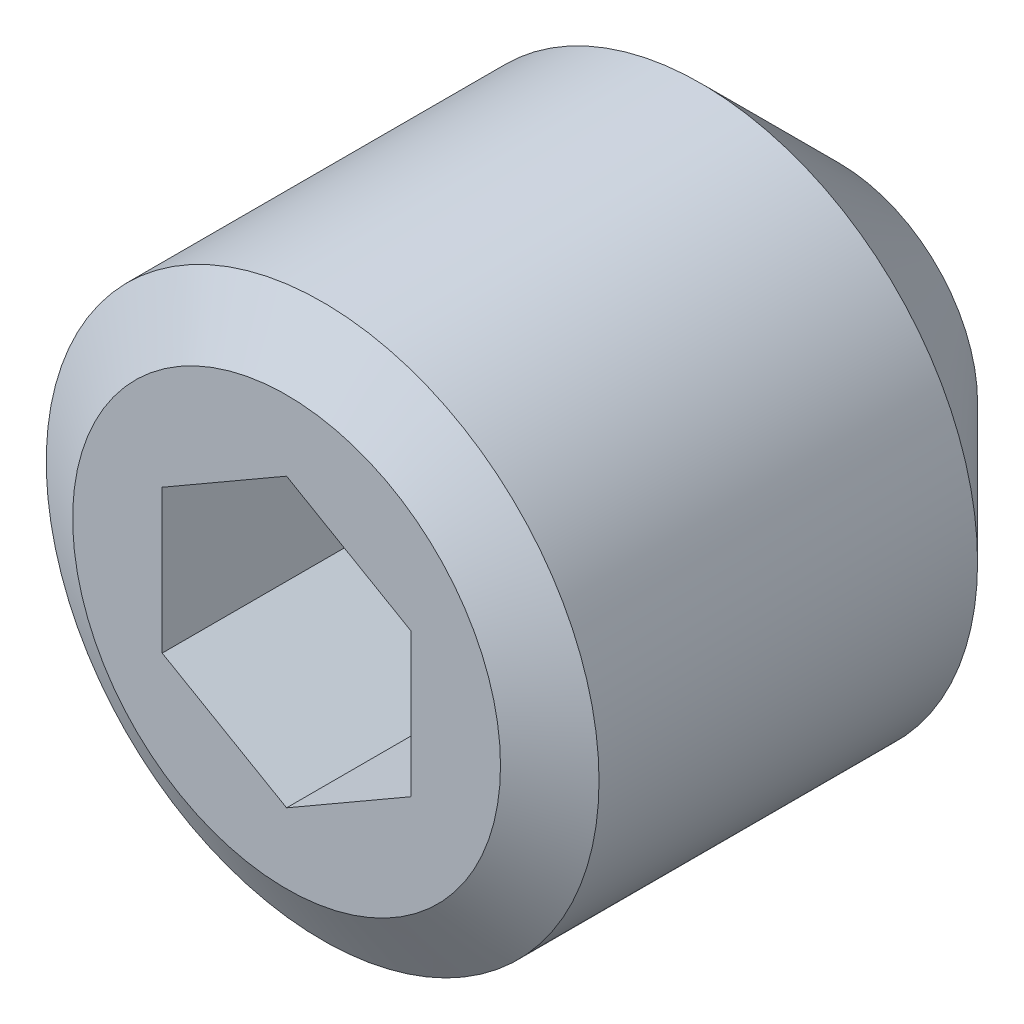
ISO-10303-21;
HEADER;
FILE_DESCRIPTION(('STEP AP214'),'2;1');
FILE_NAME('part.step','',(''),(''),'','','');
FILE_SCHEMA(('AUTOMOTIVE_DESIGN { 1 0 10303 214 1 1 1 1 }'));
ENDSEC;
DATA;
#1=APPLICATION_CONTEXT('core data for automotive mechanical design processes');
#2=APPLICATION_PROTOCOL_DEFINITION('international standard','automotive_design',2000,#1);
#3=PRODUCT_CONTEXT('',#1,'mechanical');
#4=PRODUCT('Part','Part','',(#3));
#5=PRODUCT_RELATED_PRODUCT_CATEGORY('part','',(#4));
#6=PRODUCT_DEFINITION_FORMATION('','',#4);
#7=PRODUCT_DEFINITION_CONTEXT('part definition',#1,'design');
#8=PRODUCT_DEFINITION('design','',#6,#7);
#9=PRODUCT_DEFINITION_SHAPE('','',#8);
#10=(LENGTH_UNIT() NAMED_UNIT(*) SI_UNIT(.MILLI.,.METRE.));
#11=(NAMED_UNIT(*) PLANE_ANGLE_UNIT() SI_UNIT($,.RADIAN.));
#12=(NAMED_UNIT(*) SI_UNIT($,.STERADIAN.) SOLID_ANGLE_UNIT());
#13=UNCERTAINTY_MEASURE_WITH_UNIT(LENGTH_MEASURE(1.E-05),#10,'distance_accuracy_value','');
#14=(GEOMETRIC_REPRESENTATION_CONTEXT(3) GLOBAL_UNCERTAINTY_ASSIGNED_CONTEXT((#13)) GLOBAL_UNIT_ASSIGNED_CONTEXT((#10,
#11,#12)) REPRESENTATION_CONTEXT('',''));
#15=CARTESIAN_POINT('',(0.,0.,0.));
#16=DIRECTION('',(0.,0.,1.));
#17=DIRECTION('',(1.,0.,0.));
#18=AXIS2_PLACEMENT_3D('',#15,#16,#17);
#19=CARTESIAN_POINT('',(0.,0.,0.));
#20=DIRECTION('',(0.,0.,-1.));
#21=DIRECTION('',(-1.,0.,0.));
#22=AXIS2_PLACEMENT_3D('',#19,#20,#21);
#23=PLANE('',#22);
#24=DIRECTION('',(0.866025403784439,0.5,0.));
#25=VECTOR('',#24,1.);
#26=CARTESIAN_POINT('',(0.,-0.519615242270663,0.));
#27=LINE('',#26,#25);
#28=CARTESIAN_POINT('',(0.,-0.519615242270663,0.));
#29=VERTEX_POINT('',#28);
#30=CARTESIAN_POINT('',(0.45,-0.259807621135332,0.));
#31=VERTEX_POINT('',#30);
#32=EDGE_CURVE('E105',#29,#31,#27,.T.);
#33=ORIENTED_EDGE('',*,*,#32,.F.);
#34=DIRECTION('',(0.866025403784439,-0.5,0.));
#35=VECTOR('',#34,1.);
#36=CARTESIAN_POINT('',(-0.45,-0.259807621135332,0.));
#37=LINE('',#36,#35);
#38=CARTESIAN_POINT('',(-0.45,-0.259807621135332,0.));
#39=VERTEX_POINT('',#38);
#40=EDGE_CURVE('E31',#39,#29,#37,.T.);
#41=ORIENTED_EDGE('',*,*,#40,.F.);
#42=DIRECTION('',(0.,-1.,0.));
#43=VECTOR('',#42,1.);
#44=CARTESIAN_POINT('',(-0.45,0.259807621135332,0.));
#45=LINE('',#44,#43);
#46=CARTESIAN_POINT('',(-0.45,0.259807621135332,0.));
#47=VERTEX_POINT('',#46);
#48=EDGE_CURVE('E114',#47,#39,#45,.T.);
#49=ORIENTED_EDGE('',*,*,#48,.F.);
#50=DIRECTION('',(-0.866025403784439,-0.5,0.));
#51=VECTOR('',#50,1.);
#52=CARTESIAN_POINT('',(0.,0.519615242270663,0.));
#53=LINE('',#52,#51);
#54=CARTESIAN_POINT('',(0.,0.519615242270663,0.));
#55=VERTEX_POINT('',#54);
#56=EDGE_CURVE('E112',#55,#47,#53,.T.);
#57=ORIENTED_EDGE('',*,*,#56,.F.);
#58=DIRECTION('',(-0.866025403784439,0.5,0.));
#59=VECTOR('',#58,1.);
#60=CARTESIAN_POINT('',(0.45,0.259807621135332,0.));
#61=LINE('',#60,#59);
#62=CARTESIAN_POINT('',(0.45,0.259807621135332,0.));
#63=VERTEX_POINT('',#62);
#64=EDGE_CURVE('E79',#63,#55,#61,.T.);
#65=ORIENTED_EDGE('',*,*,#64,.F.);
#66=DIRECTION('',(0.,1.,0.));
#67=VECTOR('',#66,1.);
#68=CARTESIAN_POINT('',(0.45,-0.259807621135332,0.));
#69=LINE('',#68,#67);
#70=EDGE_CURVE('E108',#31,#63,#69,.T.);
#71=ORIENTED_EDGE('',*,*,#70,.F.);
#72=EDGE_LOOP('',(#33,#41,#49,#57,#65,#71));
#73=FACE_BOUND('',#72,.T.);
#74=CARTESIAN_POINT('',(0.,0.,0.));
#75=DIRECTION('',(0.,0.,1.));
#76=DIRECTION('',(1.,0.,0.));
#77=AXIS2_PLACEMENT_3D('',#74,#75,#76);
#78=CIRCLE('',#77,0.774);
#79=CARTESIAN_POINT('',(0.774,0.,0.));
#80=VERTEX_POINT('',#79);
#81=EDGE_CURVE('E11',#80,#80,#78,.T.);
#82=ORIENTED_EDGE('',*,*,#81,.T.);
#83=EDGE_LOOP('',(#82));
#84=FACE_BOUND('',#83,.T.);
#85=ADVANCED_FACE('F17',(#73,#84),#23,.F.);
#86=CARTESIAN_POINT('',(0.,0.,-0.130481160836855));
#87=DIRECTION('',(0.,0.,-1.));
#88=DIRECTION('',(-1.,0.,0.));
#89=AXIS2_PLACEMENT_3D('',#86,#87,#88);
#90=CONICAL_SURFACE('',#89,1.,1.0471975511966);
#91=ORIENTED_EDGE('',*,*,#81,.F.);
#92=EDGE_LOOP('',(#91));
#93=FACE_BOUND('',#92,.T.);
#94=CARTESIAN_POINT('',(0.,0.,-0.130481160836855));
#95=DIRECTION('',(0.,0.,1.));
#96=DIRECTION('',(1.,0.,0.));
#97=AXIS2_PLACEMENT_3D('',#94,#95,#96);
#98=CIRCLE('',#97,1.);
#99=CARTESIAN_POINT('',(1.,0.,-0.130481160836855));
#100=VERTEX_POINT('',#99);
#101=EDGE_CURVE('E24',#100,#100,#98,.T.);
#102=ORIENTED_EDGE('',*,*,#101,.T.);
#103=EDGE_LOOP('',(#102));
#104=FACE_BOUND('',#103,.T.);
#105=ADVANCED_FACE('F131',(#93,#104),#90,.T.);
#106=CARTESIAN_POINT('',(0.,0.,0.));
#107=DIRECTION('',(0.,0.,1.));
#108=DIRECTION('',(1.,0.,0.));
#109=AXIS2_PLACEMENT_3D('',#106,#107,#108);
#110=CYLINDRICAL_SURFACE('',#109,1.);
#111=ORIENTED_EDGE('',*,*,#101,.F.);
#112=EDGE_LOOP('',(#111));
#113=FACE_BOUND('',#112,.T.);
#114=CARTESIAN_POINT('',(0.,0.,-1.5));
#115=DIRECTION('',(0.,0.,1.));
#116=DIRECTION('',(1.,0.,0.));
#117=AXIS2_PLACEMENT_3D('',#114,#115,#116);
#118=CIRCLE('',#117,1.);
#119=CARTESIAN_POINT('',(1.,0.,-1.5));
#120=VERTEX_POINT('',#119);
#121=EDGE_CURVE('E126',#120,#120,#118,.T.);
#122=ORIENTED_EDGE('',*,*,#121,.T.);
#123=EDGE_LOOP('',(#122));
#124=FACE_BOUND('',#123,.T.);
#125=ADVANCED_FACE('F133',(#113,#124),#110,.T.);
#126=CARTESIAN_POINT('',(0.,0.,-2.));
#127=DIRECTION('',(0.,0.,1.));
#128=DIRECTION('',(1.,0.,0.));
#129=AXIS2_PLACEMENT_3D('',#126,#127,#128);
#130=CONICAL_SURFACE('',#129,0.5,0.785398163397446);
#131=ORIENTED_EDGE('',*,*,#121,.F.);
#132=EDGE_LOOP('',(#131));
#133=FACE_BOUND('',#132,.T.);
#134=CARTESIAN_POINT('',(0.,0.,-2.));
#135=DIRECTION('',(0.,0.,1.));
#136=DIRECTION('',(1.,0.,0.));
#137=AXIS2_PLACEMENT_3D('',#134,#135,#136);
#138=CIRCLE('',#137,0.5);
#139=CARTESIAN_POINT('',(0.5,0.,-2.));
#140=VERTEX_POINT('',#139);
#141=EDGE_CURVE('E118',#140,#140,#138,.T.);
#142=ORIENTED_EDGE('',*,*,#141,.T.);
#143=EDGE_LOOP('',(#142));
#144=FACE_BOUND('',#143,.T.);
#145=ADVANCED_FACE('F136',(#133,#144),#130,.T.);
#146=CARTESIAN_POINT('',(0.,0.5,-2.));
#147=DIRECTION('',(0.,0.,1.));
#148=DIRECTION('',(1.,0.,0.));
#149=AXIS2_PLACEMENT_3D('',#146,#147,#148);
#150=PLANE('',#149);
#151=ORIENTED_EDGE('',*,*,#141,.F.);
#152=EDGE_LOOP('',(#151));
#153=FACE_BOUND('',#152,.T.);
#154=ADVANCED_FACE('F142',(#153),#150,.F.);
#155=CARTESIAN_POINT('',(-0.45,-0.259807621135332,-1.2));
#156=DIRECTION('',(-0.5,-0.866025403784439,0.));
#157=DIRECTION('',(0.866025403784439,-0.5,0.));
#158=AXIS2_PLACEMENT_3D('',#155,#156,#157);
#159=PLANE('',#158);
#160=ORIENTED_EDGE('',*,*,#40,.T.);
#161=DIRECTION('',(0.,0.,1.));
#162=VECTOR('',#161,1.);
#163=CARTESIAN_POINT('',(0.,-0.519615242270663,-1.2));
#164=LINE('',#163,#162);
#165=CARTESIAN_POINT('',(0.,-0.519615242270663,-1.2));
#166=VERTEX_POINT('',#165);
#167=EDGE_CURVE('E61',#166,#29,#164,.T.);
#168=ORIENTED_EDGE('',*,*,#167,.F.);
#169=DIRECTION('',(0.866025403784439,-0.5,0.));
#170=VECTOR('',#169,1.);
#171=CARTESIAN_POINT('',(-0.45,-0.259807621135332,-1.2));
#172=LINE('',#171,#170);
#173=CARTESIAN_POINT('',(-0.45,-0.259807621135332,-1.2));
#174=VERTEX_POINT('',#173);
#175=EDGE_CURVE('E116',#174,#166,#172,.T.);
#176=ORIENTED_EDGE('',*,*,#175,.F.);
#177=DIRECTION('',(0.,0.,1.));
#178=VECTOR('',#177,1.);
#179=CARTESIAN_POINT('',(-0.45,-0.259807621135332,-1.2));
#180=LINE('',#179,#178);
#181=EDGE_CURVE('E39',#174,#39,#180,.T.);
#182=ORIENTED_EDGE('',*,*,#181,.T.);
#183=EDGE_LOOP('',(#160,#168,#176,#182));
#184=FACE_BOUND('',#183,.T.);
#185=ADVANCED_FACE('F147',(#184),#159,.F.);
#186=CARTESIAN_POINT('',(-0.45,0.259807621135332,-1.2));
#187=DIRECTION('',(-1.,0.,0.));
#188=DIRECTION('',(0.,-1.,0.));
#189=AXIS2_PLACEMENT_3D('',#186,#187,#188);
#190=PLANE('',#189);
#191=ORIENTED_EDGE('',*,*,#48,.T.);
#192=ORIENTED_EDGE('',*,*,#181,.F.);
#193=DIRECTION('',(0.,-1.,0.));
#194=VECTOR('',#193,1.);
#195=CARTESIAN_POINT('',(-0.45,0.259807621135332,-1.2));
#196=LINE('',#195,#194);
#197=CARTESIAN_POINT('',(-0.45,0.259807621135332,-1.2));
#198=VERTEX_POINT('',#197);
#199=EDGE_CURVE('E91',#198,#174,#196,.T.);
#200=ORIENTED_EDGE('',*,*,#199,.F.);
#201=DIRECTION('',(0.,0.,1.));
#202=VECTOR('',#201,1.);
#203=CARTESIAN_POINT('',(-0.45,0.259807621135332,-1.2));
#204=LINE('',#203,#202);
#205=EDGE_CURVE('E83',#198,#47,#204,.T.);
#206=ORIENTED_EDGE('',*,*,#205,.T.);
#207=EDGE_LOOP('',(#191,#192,#200,#206));
#208=FACE_BOUND('',#207,.T.);
#209=ADVANCED_FACE('F154',(#208),#190,.F.);
#210=CARTESIAN_POINT('',(0.,0.519615242270663,-1.2));
#211=DIRECTION('',(-0.5,0.866025403784439,0.));
#212=DIRECTION('',(-0.866025403784439,-0.5,0.));
#213=AXIS2_PLACEMENT_3D('',#210,#211,#212);
#214=PLANE('',#213);
#215=ORIENTED_EDGE('',*,*,#56,.T.);
#216=ORIENTED_EDGE('',*,*,#205,.F.);
#217=DIRECTION('',(-0.866025403784439,-0.5,0.));
#218=VECTOR('',#217,1.);
#219=CARTESIAN_POINT('',(0.,0.519615242270663,-1.2));
#220=LINE('',#219,#218);
#221=CARTESIAN_POINT('',(0.,0.519615242270663,-1.2));
#222=VERTEX_POINT('',#221);
#223=EDGE_CURVE('E87',#222,#198,#220,.T.);
#224=ORIENTED_EDGE('',*,*,#223,.F.);
#225=DIRECTION('',(0.,0.,1.));
#226=VECTOR('',#225,1.);
#227=CARTESIAN_POINT('',(0.,0.519615242270663,-1.2));
#228=LINE('',#227,#226);
#229=EDGE_CURVE('E72',#222,#55,#228,.T.);
#230=ORIENTED_EDGE('',*,*,#229,.T.);
#231=EDGE_LOOP('',(#215,#216,#224,#230));
#232=FACE_BOUND('',#231,.T.);
#233=ADVANCED_FACE('F88',(#232),#214,.F.);
#234=CARTESIAN_POINT('',(0.45,0.259807621135332,-1.2));
#235=DIRECTION('',(0.5,0.866025403784439,0.));
#236=DIRECTION('',(-0.866025403784439,0.5,0.));
#237=AXIS2_PLACEMENT_3D('',#234,#235,#236);
#238=PLANE('',#237);
#239=ORIENTED_EDGE('',*,*,#64,.T.);
#240=ORIENTED_EDGE('',*,*,#229,.F.);
#241=DIRECTION('',(-0.866025403784439,0.5,0.));
#242=VECTOR('',#241,1.);
#243=CARTESIAN_POINT('',(0.45,0.259807621135332,-1.2));
#244=LINE('',#243,#242);
#245=CARTESIAN_POINT('',(0.45,0.259807621135332,-1.2));
#246=VERTEX_POINT('',#245);
#247=EDGE_CURVE('E76',#246,#222,#244,.T.);
#248=ORIENTED_EDGE('',*,*,#247,.F.);
#249=DIRECTION('',(0.,0.,1.));
#250=VECTOR('',#249,1.);
#251=CARTESIAN_POINT('',(0.45,0.259807621135332,-1.2));
#252=LINE('',#251,#250);
#253=EDGE_CURVE('E84',#246,#63,#252,.T.);
#254=ORIENTED_EDGE('',*,*,#253,.T.);
#255=EDGE_LOOP('',(#239,#240,#248,#254));
#256=FACE_BOUND('',#255,.T.);
#257=ADVANCED_FACE('F74',(#256),#238,.F.);
#258=CARTESIAN_POINT('',(0.45,-0.259807621135332,-1.2));
#259=DIRECTION('',(1.,0.,0.));
#260=DIRECTION('',(0.,1.,0.));
#261=AXIS2_PLACEMENT_3D('',#258,#259,#260);
#262=PLANE('',#261);
#263=ORIENTED_EDGE('',*,*,#70,.T.);
#264=ORIENTED_EDGE('',*,*,#253,.F.);
#265=DIRECTION('',(0.,1.,0.));
#266=VECTOR('',#265,1.);
#267=CARTESIAN_POINT('',(0.45,-0.259807621135332,-1.2));
#268=LINE('',#267,#266);
#269=CARTESIAN_POINT('',(0.45,-0.259807621135332,-1.2));
#270=VERTEX_POINT('',#269);
#271=EDGE_CURVE('E97',#270,#246,#268,.T.);
#272=ORIENTED_EDGE('',*,*,#271,.F.);
#273=DIRECTION('',(0.,0.,1.));
#274=VECTOR('',#273,1.);
#275=CARTESIAN_POINT('',(0.45,-0.259807621135332,-1.2));
#276=LINE('',#275,#274);
#277=EDGE_CURVE('E121',#270,#31,#276,.T.);
#278=ORIENTED_EDGE('',*,*,#277,.T.);
#279=EDGE_LOOP('',(#263,#264,#272,#278));
#280=FACE_BOUND('',#279,.T.);
#281=ADVANCED_FACE('F182',(#280),#262,.F.);
#282=CARTESIAN_POINT('',(0.,-0.519615242270663,-1.2));
#283=DIRECTION('',(0.5,-0.866025403784439,0.));
#284=DIRECTION('',(0.866025403784439,0.5,0.));
#285=AXIS2_PLACEMENT_3D('',#282,#283,#284);
#286=PLANE('',#285);
#287=ORIENTED_EDGE('',*,*,#32,.T.);
#288=ORIENTED_EDGE('',*,*,#277,.F.);
#289=DIRECTION('',(0.866025403784439,0.5,0.));
#290=VECTOR('',#289,1.);
#291=CARTESIAN_POINT('',(0.,-0.519615242270663,-1.2));
#292=LINE('',#291,#290);
#293=EDGE_CURVE('E99',#166,#270,#292,.T.);
#294=ORIENTED_EDGE('',*,*,#293,.F.);
#295=ORIENTED_EDGE('',*,*,#167,.T.);
#296=EDGE_LOOP('',(#287,#288,#294,#295));
#297=FACE_BOUND('',#296,.T.);
#298=ADVANCED_FACE('F169',(#297),#286,.F.);
#299=CARTESIAN_POINT('',(0.,-0.519615242270663,-1.2));
#300=DIRECTION('',(0.,0.,1.));
#301=DIRECTION('',(1.,0.,0.));
#302=AXIS2_PLACEMENT_3D('',#299,#300,#301);
#303=PLANE('',#302);
#304=ORIENTED_EDGE('',*,*,#175,.T.);
#305=ORIENTED_EDGE('',*,*,#293,.T.);
#306=ORIENTED_EDGE('',*,*,#271,.T.);
#307=ORIENTED_EDGE('',*,*,#247,.T.);
#308=ORIENTED_EDGE('',*,*,#223,.T.);
#309=ORIENTED_EDGE('',*,*,#199,.T.);
#310=EDGE_LOOP('',(#304,#305,#306,#307,#308,#309));
#311=FACE_BOUND('',#310,.T.);
#312=ADVANCED_FACE('F94',(#311),#303,.T.);
#313=CLOSED_SHELL('',(#85,#105,#125,#145,#154,#185,#209,#233,#257,#281,#298,#312));
#314=MANIFOLD_SOLID_BREP('B1',#313);
#315=ADVANCED_BREP_SHAPE_REPRESENTATION('',(#18,#314),#14);
#316=SHAPE_DEFINITION_REPRESENTATION(#9,#315);
ENDSEC;
END-ISO-10303-21;
